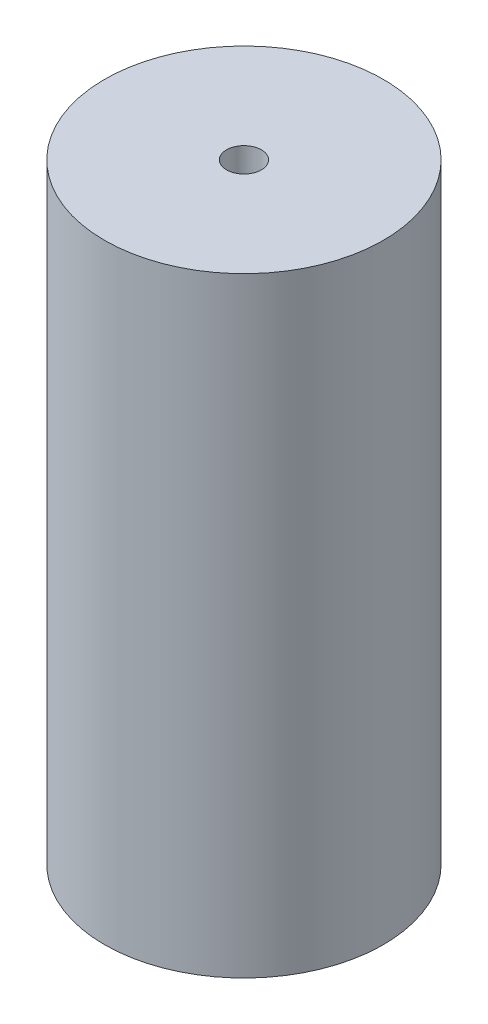
ISO-10303-21;
HEADER;
FILE_DESCRIPTION(('STEP AP214'),'2;1');
FILE_NAME('part.step','',(''),(''),'','','');
FILE_SCHEMA(('AUTOMOTIVE_DESIGN { 1 0 10303 214 1 1 1 1 }'));
ENDSEC;
DATA;
#1=APPLICATION_CONTEXT('core data for automotive mechanical design processes');
#2=APPLICATION_PROTOCOL_DEFINITION('international standard','automotive_design',2000,#1);
#3=PRODUCT_CONTEXT('',#1,'mechanical');
#4=PRODUCT('Part','Part','',(#3));
#5=PRODUCT_RELATED_PRODUCT_CATEGORY('part','',(#4));
#6=PRODUCT_DEFINITION_FORMATION('','',#4);
#7=PRODUCT_DEFINITION_CONTEXT('part definition',#1,'design');
#8=PRODUCT_DEFINITION('design','',#6,#7);
#9=PRODUCT_DEFINITION_SHAPE('','',#8);
#10=(LENGTH_UNIT() NAMED_UNIT(*) SI_UNIT(.MILLI.,.METRE.));
#11=(NAMED_UNIT(*) PLANE_ANGLE_UNIT() SI_UNIT($,.RADIAN.));
#12=(NAMED_UNIT(*) SI_UNIT($,.STERADIAN.) SOLID_ANGLE_UNIT());
#13=UNCERTAINTY_MEASURE_WITH_UNIT(LENGTH_MEASURE(1.E-05),#10,'distance_accuracy_value','');
#14=(GEOMETRIC_REPRESENTATION_CONTEXT(3) GLOBAL_UNCERTAINTY_ASSIGNED_CONTEXT((#13)) GLOBAL_UNIT_ASSIGNED_CONTEXT((#10,
#11,#12)) REPRESENTATION_CONTEXT('',''));
#15=CARTESIAN_POINT('',(0.,0.,0.));
#16=DIRECTION('',(0.,0.,1.));
#17=DIRECTION('',(1.,0.,0.));
#18=AXIS2_PLACEMENT_3D('',#15,#16,#17);
#19=CARTESIAN_POINT('',(0.,175.,0.));
#20=DIRECTION('',(0.,1.,0.));
#21=DIRECTION('',(0.,0.,1.));
#22=AXIS2_PLACEMENT_3D('',#19,#20,#21);
#23=PLANE('',#22);
#24=CARTESIAN_POINT('',(0.,175.,0.));
#25=DIRECTION('',(0.,1.,0.));
#26=DIRECTION('',(0.,0.,1.));
#27=AXIS2_PLACEMENT_3D('',#24,#25,#26);
#28=CIRCLE('',#27,40.);
#29=CARTESIAN_POINT('',(0.,175.,40.));
#30=VERTEX_POINT('',#29);
#31=EDGE_CURVE('E10',#30,#30,#28,.T.);
#32=ORIENTED_EDGE('',*,*,#31,.T.);
#33=EDGE_LOOP('',(#32));
#34=FACE_BOUND('',#33,.T.);
#35=CARTESIAN_POINT('',(0.,175.,0.));
#36=DIRECTION('',(0.,1.,0.));
#37=DIRECTION('',(0.,0.,1.));
#38=AXIS2_PLACEMENT_3D('',#35,#36,#37);
#39=CIRCLE('',#38,5.);
#40=CARTESIAN_POINT('',(0.,175.,5.));
#41=VERTEX_POINT('',#40);
#42=EDGE_CURVE('E54',#41,#41,#39,.T.);
#43=ORIENTED_EDGE('',*,*,#42,.F.);
#44=EDGE_LOOP('',(#43));
#45=FACE_BOUND('',#44,.T.);
#46=ADVANCED_FACE('F43',(#34,#45),#23,.T.);
#47=CARTESIAN_POINT('',(0.,0.,0.));
#48=DIRECTION('',(0.,1.,0.));
#49=DIRECTION('',(0.,0.,1.));
#50=AXIS2_PLACEMENT_3D('',#47,#48,#49);
#51=PLANE('',#50);
#52=CARTESIAN_POINT('',(0.,0.,0.));
#53=DIRECTION('',(0.,1.,0.));
#54=DIRECTION('',(0.,0.,1.));
#55=AXIS2_PLACEMENT_3D('',#52,#53,#54);
#56=CIRCLE('',#55,40.);
#57=CARTESIAN_POINT('',(0.,0.,40.));
#58=VERTEX_POINT('',#57);
#59=EDGE_CURVE('E47',#58,#58,#56,.T.);
#60=ORIENTED_EDGE('',*,*,#59,.F.);
#61=EDGE_LOOP('',(#60));
#62=FACE_BOUND('',#61,.T.);
#63=CARTESIAN_POINT('',(0.,0.,0.));
#64=DIRECTION('',(0.,1.,0.));
#65=DIRECTION('',(0.,0.,1.));
#66=AXIS2_PLACEMENT_3D('',#63,#64,#65);
#67=CIRCLE('',#66,5.);
#68=CARTESIAN_POINT('',(0.,0.,5.));
#69=VERTEX_POINT('',#68);
#70=EDGE_CURVE('E56',#69,#69,#67,.T.);
#71=ORIENTED_EDGE('',*,*,#70,.T.);
#72=EDGE_LOOP('',(#71));
#73=FACE_BOUND('',#72,.T.);
#74=ADVANCED_FACE('F66',(#62,#73),#51,.F.);
#75=CARTESIAN_POINT('',(0.,175.,0.));
#76=DIRECTION('',(0.,-1.,0.));
#77=DIRECTION('',(0.,0.,-1.));
#78=AXIS2_PLACEMENT_3D('',#75,#76,#77);
#79=CYLINDRICAL_SURFACE('',#78,40.);
#80=ORIENTED_EDGE('',*,*,#31,.F.);
#81=EDGE_LOOP('',(#80));
#82=FACE_BOUND('',#81,.T.);
#83=ORIENTED_EDGE('',*,*,#59,.T.);
#84=EDGE_LOOP('',(#83));
#85=FACE_BOUND('',#84,.T.);
#86=ADVANCED_FACE('F45',(#82,#85),#79,.T.);
#87=CARTESIAN_POINT('',(0.,175.,0.));
#88=DIRECTION('',(0.,-1.,0.));
#89=DIRECTION('',(0.,0.,-1.));
#90=AXIS2_PLACEMENT_3D('',#87,#88,#89);
#91=CYLINDRICAL_SURFACE('',#90,5.);
#92=ORIENTED_EDGE('',*,*,#42,.T.);
#93=EDGE_LOOP('',(#92));
#94=FACE_BOUND('',#93,.T.);
#95=ORIENTED_EDGE('',*,*,#70,.F.);
#96=EDGE_LOOP('',(#95));
#97=FACE_BOUND('',#96,.T.);
#98=ADVANCED_FACE('F62',(#94,#97),#91,.F.);
#99=CLOSED_SHELL('',(#46,#74,#86,#98));
#100=MANIFOLD_SOLID_BREP('B2',#99);
#101=ADVANCED_BREP_SHAPE_REPRESENTATION('',(#18,#100),#14);
#102=SHAPE_DEFINITION_REPRESENTATION(#9,#101);
ENDSEC;
END-ISO-10303-21;
